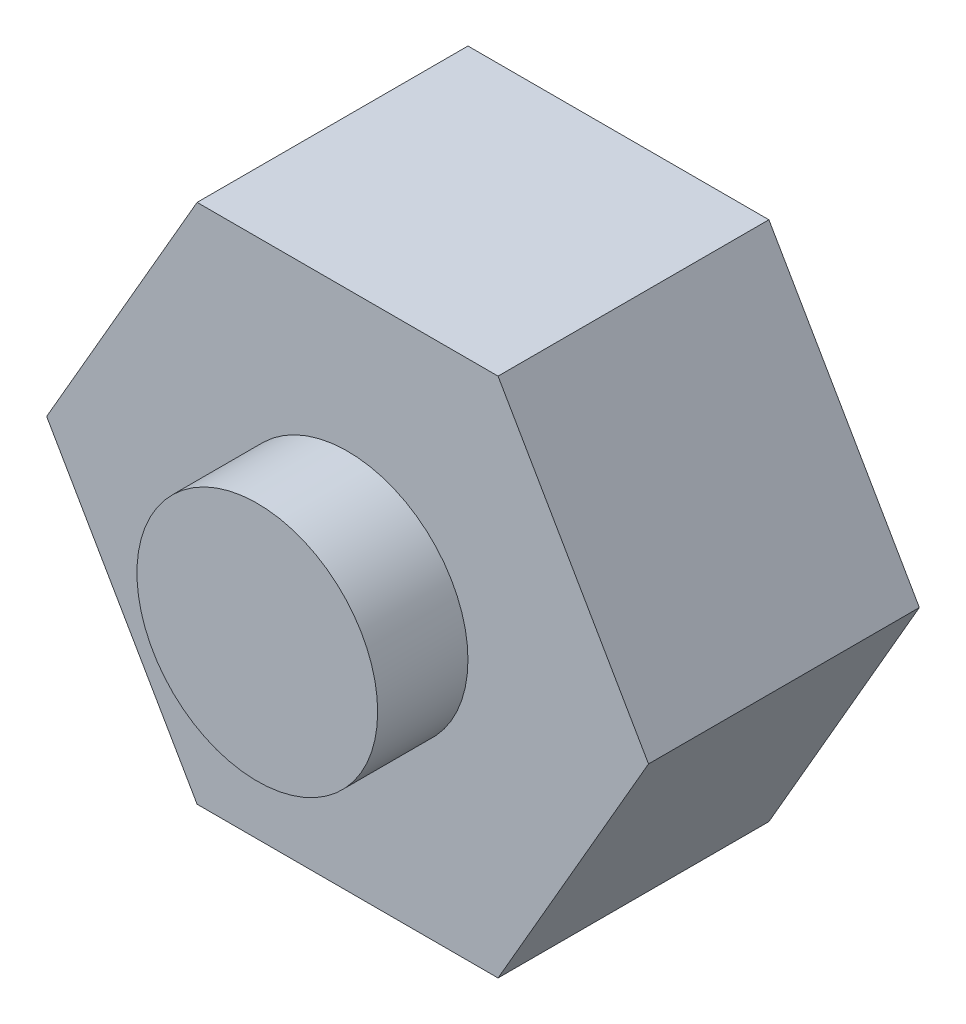
ISO-10303-21;
HEADER;
FILE_DESCRIPTION(('STEP AP214'),'2;1');
FILE_NAME('part.step','',(''),(''),'','','');
FILE_SCHEMA(('AUTOMOTIVE_DESIGN { 1 0 10303 214 1 1 1 1 }'));
ENDSEC;
DATA;
#1=APPLICATION_CONTEXT('core data for automotive mechanical design processes');
#2=APPLICATION_PROTOCOL_DEFINITION('international standard','automotive_design',2000,#1);
#3=PRODUCT_CONTEXT('',#1,'mechanical');
#4=PRODUCT('Part','Part','',(#3));
#5=PRODUCT_RELATED_PRODUCT_CATEGORY('part','',(#4));
#6=PRODUCT_DEFINITION_FORMATION('','',#4);
#7=PRODUCT_DEFINITION_CONTEXT('part definition',#1,'design');
#8=PRODUCT_DEFINITION('design','',#6,#7);
#9=PRODUCT_DEFINITION_SHAPE('','',#8);
#10=(LENGTH_UNIT() NAMED_UNIT(*) SI_UNIT(.MILLI.,.METRE.));
#11=(NAMED_UNIT(*) PLANE_ANGLE_UNIT() SI_UNIT($,.RADIAN.));
#12=(NAMED_UNIT(*) SI_UNIT($,.STERADIAN.) SOLID_ANGLE_UNIT());
#13=UNCERTAINTY_MEASURE_WITH_UNIT(LENGTH_MEASURE(1.E-05),#10,'distance_accuracy_value','');
#14=(GEOMETRIC_REPRESENTATION_CONTEXT(3) GLOBAL_UNCERTAINTY_ASSIGNED_CONTEXT((#13)) GLOBAL_UNIT_ASSIGNED_CONTEXT((#10,
#11,#12)) REPRESENTATION_CONTEXT('',''));
#15=CARTESIAN_POINT('',(0.,0.,0.));
#16=DIRECTION('',(0.,0.,1.));
#17=DIRECTION('',(1.,0.,0.));
#18=AXIS2_PLACEMENT_3D('',#15,#16,#17);
#19=CARTESIAN_POINT('',(0.,0.,18.));
#20=DIRECTION('',(0.,0.,1.));
#21=DIRECTION('',(1.,0.,0.));
#22=AXIS2_PLACEMENT_3D('',#19,#20,#21);
#23=PLANE('',#22);
#24=CARTESIAN_POINT('',(0.,0.,18.));
#25=DIRECTION('',(0.,0.,1.));
#26=DIRECTION('',(1.,0.,0.));
#27=AXIS2_PLACEMENT_3D('',#24,#25,#26);
#28=CIRCLE('',#27,8.);
#29=CARTESIAN_POINT('',(8.,0.,18.));
#30=VERTEX_POINT('',#29);
#31=EDGE_CURVE('E46',#30,#30,#28,.T.);
#32=ORIENTED_EDGE('',*,*,#31,.F.);
#33=EDGE_LOOP('',(#32));
#34=FACE_BOUND('',#33,.T.);
#35=DIRECTION('',(1.,0.,0.));
#36=VECTOR('',#35,1.);
#37=CARTESIAN_POINT('',(-9.99999999999999,-17.3205080756888,18.));
#38=LINE('',#37,#36);
#39=CARTESIAN_POINT('',(-9.99999999999999,-17.3205080756888,18.));
#40=VERTEX_POINT('',#39);
#41=CARTESIAN_POINT('',(10.,-17.3205080756888,18.));
#42=VERTEX_POINT('',#41);
#43=EDGE_CURVE('E137',#40,#42,#38,.T.);
#44=ORIENTED_EDGE('',*,*,#43,.T.);
#45=DIRECTION('',(0.5,0.866025403784439,0.));
#46=VECTOR('',#45,1.);
#47=CARTESIAN_POINT('',(10.,-17.3205080756888,18.));
#48=LINE('',#47,#46);
#49=CARTESIAN_POINT('',(20.,0.,18.));
#50=VERTEX_POINT('',#49);
#51=EDGE_CURVE('E126',#42,#50,#48,.T.);
#52=ORIENTED_EDGE('',*,*,#51,.T.);
#53=DIRECTION('',(-0.5,0.866025403784439,0.));
#54=VECTOR('',#53,1.);
#55=CARTESIAN_POINT('',(20.,0.,18.));
#56=LINE('',#55,#54);
#57=CARTESIAN_POINT('',(10.,17.3205080756888,18.));
#58=VERTEX_POINT('',#57);
#59=EDGE_CURVE('E129',#50,#58,#56,.T.);
#60=ORIENTED_EDGE('',*,*,#59,.T.);
#61=DIRECTION('',(-1.,0.,0.));
#62=VECTOR('',#61,1.);
#63=CARTESIAN_POINT('',(10.,17.3205080756888,18.));
#64=LINE('',#63,#62);
#65=CARTESIAN_POINT('',(-9.99999999999999,17.3205080756888,18.));
#66=VERTEX_POINT('',#65);
#67=EDGE_CURVE('E57',#58,#66,#64,.T.);
#68=ORIENTED_EDGE('',*,*,#67,.T.);
#69=DIRECTION('',(-0.5,-0.866025403784438,0.));
#70=VECTOR('',#69,1.);
#71=CARTESIAN_POINT('',(-9.99999999999999,17.3205080756888,18.));
#72=LINE('',#71,#70);
#73=CARTESIAN_POINT('',(-20.,0.,18.));
#74=VERTEX_POINT('',#73);
#75=EDGE_CURVE('E102',#66,#74,#72,.T.);
#76=ORIENTED_EDGE('',*,*,#75,.T.);
#77=DIRECTION('',(0.5,-0.866025403784438,0.));
#78=VECTOR('',#77,1.);
#79=CARTESIAN_POINT('',(-20.,0.,18.));
#80=LINE('',#79,#78);
#81=EDGE_CURVE('E134',#74,#40,#80,.T.);
#82=ORIENTED_EDGE('',*,*,#81,.T.);
#83=EDGE_LOOP('',(#44,#52,#60,#68,#76,#82));
#84=FACE_BOUND('',#83,.T.);
#85=ADVANCED_FACE('F42',(#34,#84),#23,.T.);
#86=CARTESIAN_POINT('',(0.,0.,24.));
#87=DIRECTION('',(0.,0.,-1.));
#88=DIRECTION('',(-1.,0.,0.));
#89=AXIS2_PLACEMENT_3D('',#86,#87,#88);
#90=CYLINDRICAL_SURFACE('',#89,8.);
#91=ORIENTED_EDGE('',*,*,#31,.T.);
#92=EDGE_LOOP('',(#91));
#93=FACE_BOUND('',#92,.T.);
#94=CARTESIAN_POINT('',(0.,0.,24.));
#95=DIRECTION('',(0.,0.,1.));
#96=DIRECTION('',(1.,0.,0.));
#97=AXIS2_PLACEMENT_3D('',#94,#95,#96);
#98=CIRCLE('',#97,8.);
#99=CARTESIAN_POINT('',(8.,0.,24.));
#100=VERTEX_POINT('',#99);
#101=EDGE_CURVE('E12',#100,#100,#98,.T.);
#102=ORIENTED_EDGE('',*,*,#101,.F.);
#103=EDGE_LOOP('',(#102));
#104=FACE_BOUND('',#103,.T.);
#105=ADVANCED_FACE('F44',(#93,#104),#90,.T.);
#106=CARTESIAN_POINT('',(0.,0.,24.));
#107=DIRECTION('',(0.,0.,1.));
#108=DIRECTION('',(1.,0.,0.));
#109=AXIS2_PLACEMENT_3D('',#106,#107,#108);
#110=PLANE('',#109);
#111=ORIENTED_EDGE('',*,*,#101,.T.);
#112=EDGE_LOOP('',(#111));
#113=FACE_BOUND('',#112,.T.);
#114=ADVANCED_FACE('F174',(#113),#110,.T.);
#115=CARTESIAN_POINT('',(10.,-17.3205080756888,0.));
#116=DIRECTION('',(0.866025403784439,-0.5,0.));
#117=DIRECTION('',(0.5,0.866025403784439,0.));
#118=AXIS2_PLACEMENT_3D('',#115,#116,#117);
#119=PLANE('',#118);
#120=ORIENTED_EDGE('',*,*,#51,.F.);
#121=DIRECTION('',(0.,0.,1.));
#122=VECTOR('',#121,1.);
#123=CARTESIAN_POINT('',(10.,-17.3205080756888,0.));
#124=LINE('',#123,#122);
#125=CARTESIAN_POINT('',(10.,-17.3205080756888,0.));
#126=VERTEX_POINT('',#125);
#127=EDGE_CURVE('E140',#126,#42,#124,.T.);
#128=ORIENTED_EDGE('',*,*,#127,.F.);
#129=DIRECTION('',(0.5,0.866025403784439,0.));
#130=VECTOR('',#129,1.);
#131=CARTESIAN_POINT('',(10.,-17.3205080756888,0.));
#132=LINE('',#131,#130);
#133=CARTESIAN_POINT('',(20.,0.,0.));
#134=VERTEX_POINT('',#133);
#135=EDGE_CURVE('E65',#126,#134,#132,.T.);
#136=ORIENTED_EDGE('',*,*,#135,.T.);
#137=DIRECTION('',(0.,0.,1.));
#138=VECTOR('',#137,1.);
#139=CARTESIAN_POINT('',(20.,0.,0.));
#140=LINE('',#139,#138);
#141=EDGE_CURVE('E125',#134,#50,#140,.T.);
#142=ORIENTED_EDGE('',*,*,#141,.T.);
#143=EDGE_LOOP('',(#120,#128,#136,#142));
#144=FACE_BOUND('',#143,.T.);
#145=ADVANCED_FACE('F148',(#144),#119,.T.);
#146=CARTESIAN_POINT('',(-9.99999999999999,-17.3205080756888,0.));
#147=DIRECTION('',(0.,-1.,0.));
#148=DIRECTION('',(0.,0.,-1.));
#149=AXIS2_PLACEMENT_3D('',#146,#147,#148);
#150=PLANE('',#149);
#151=ORIENTED_EDGE('',*,*,#43,.F.);
#152=DIRECTION('',(0.,0.,1.));
#153=VECTOR('',#152,1.);
#154=CARTESIAN_POINT('',(-9.99999999999999,-17.3205080756888,0.));
#155=LINE('',#154,#153);
#156=CARTESIAN_POINT('',(-9.99999999999999,-17.3205080756888,0.));
#157=VERTEX_POINT('',#156);
#158=EDGE_CURVE('E142',#157,#40,#155,.T.);
#159=ORIENTED_EDGE('',*,*,#158,.F.);
#160=DIRECTION('',(1.,0.,0.));
#161=VECTOR('',#160,1.);
#162=CARTESIAN_POINT('',(-9.99999999999999,-17.3205080756888,0.));
#163=LINE('',#162,#161);
#164=EDGE_CURVE('E119',#157,#126,#163,.T.);
#165=ORIENTED_EDGE('',*,*,#164,.T.);
#166=ORIENTED_EDGE('',*,*,#127,.T.);
#167=EDGE_LOOP('',(#151,#159,#165,#166));
#168=FACE_BOUND('',#167,.T.);
#169=ADVANCED_FACE('F155',(#168),#150,.T.);
#170=CARTESIAN_POINT('',(-20.,0.,0.));
#171=DIRECTION('',(-0.866025403784438,-0.5,0.));
#172=DIRECTION('',(0.5,-0.866025403784439,0.));
#173=AXIS2_PLACEMENT_3D('',#170,#171,#172);
#174=PLANE('',#173);
#175=ORIENTED_EDGE('',*,*,#81,.F.);
#176=DIRECTION('',(0.,0.,1.));
#177=VECTOR('',#176,1.);
#178=CARTESIAN_POINT('',(-20.,0.,0.));
#179=LINE('',#178,#177);
#180=CARTESIAN_POINT('',(-20.,0.,0.));
#181=VERTEX_POINT('',#180);
#182=EDGE_CURVE('E103',#181,#74,#179,.T.);
#183=ORIENTED_EDGE('',*,*,#182,.F.);
#184=DIRECTION('',(0.5,-0.866025403784438,0.));
#185=VECTOR('',#184,1.);
#186=CARTESIAN_POINT('',(-20.,0.,0.));
#187=LINE('',#186,#185);
#188=EDGE_CURVE('E117',#181,#157,#187,.T.);
#189=ORIENTED_EDGE('',*,*,#188,.T.);
#190=ORIENTED_EDGE('',*,*,#158,.T.);
#191=EDGE_LOOP('',(#175,#183,#189,#190));
#192=FACE_BOUND('',#191,.T.);
#193=ADVANCED_FACE('F158',(#192),#174,.T.);
#194=CARTESIAN_POINT('',(-9.99999999999999,17.3205080756888,0.));
#195=DIRECTION('',(-0.866025403784438,0.5,0.));
#196=DIRECTION('',(-0.5,-0.866025403784439,0.));
#197=AXIS2_PLACEMENT_3D('',#194,#195,#196);
#198=PLANE('',#197);
#199=ORIENTED_EDGE('',*,*,#75,.F.);
#200=DIRECTION('',(0.,0.,1.));
#201=VECTOR('',#200,1.);
#202=CARTESIAN_POINT('',(-9.99999999999999,17.3205080756888,0.));
#203=LINE('',#202,#201);
#204=CARTESIAN_POINT('',(-9.99999999999999,17.3205080756888,0.));
#205=VERTEX_POINT('',#204);
#206=EDGE_CURVE('E95',#205,#66,#203,.T.);
#207=ORIENTED_EDGE('',*,*,#206,.F.);
#208=DIRECTION('',(-0.5,-0.866025403784438,0.));
#209=VECTOR('',#208,1.);
#210=CARTESIAN_POINT('',(-9.99999999999999,17.3205080756888,0.));
#211=LINE('',#210,#209);
#212=EDGE_CURVE('E99',#205,#181,#211,.T.);
#213=ORIENTED_EDGE('',*,*,#212,.T.);
#214=ORIENTED_EDGE('',*,*,#182,.T.);
#215=EDGE_LOOP('',(#199,#207,#213,#214));
#216=FACE_BOUND('',#215,.T.);
#217=ADVANCED_FACE('F97',(#216),#198,.T.);
#218=CARTESIAN_POINT('',(10.,17.3205080756888,0.));
#219=DIRECTION('',(0.,1.,0.));
#220=DIRECTION('',(0.,0.,1.));
#221=AXIS2_PLACEMENT_3D('',#218,#219,#220);
#222=PLANE('',#221);
#223=ORIENTED_EDGE('',*,*,#67,.F.);
#224=DIRECTION('',(0.,0.,1.));
#225=VECTOR('',#224,1.);
#226=CARTESIAN_POINT('',(10.,17.3205080756888,0.));
#227=LINE('',#226,#225);
#228=CARTESIAN_POINT('',(10.,17.3205080756888,0.));
#229=VERTEX_POINT('',#228);
#230=EDGE_CURVE('E104',#229,#58,#227,.T.);
#231=ORIENTED_EDGE('',*,*,#230,.F.);
#232=DIRECTION('',(-1.,0.,0.));
#233=VECTOR('',#232,1.);
#234=CARTESIAN_POINT('',(10.,17.3205080756888,0.));
#235=LINE('',#234,#233);
#236=EDGE_CURVE('E107',#229,#205,#235,.T.);
#237=ORIENTED_EDGE('',*,*,#236,.T.);
#238=ORIENTED_EDGE('',*,*,#206,.T.);
#239=EDGE_LOOP('',(#223,#231,#237,#238));
#240=FACE_BOUND('',#239,.T.);
#241=ADVANCED_FACE('F108',(#240),#222,.T.);
#242=CARTESIAN_POINT('',(20.,0.,0.));
#243=DIRECTION('',(0.866025403784439,0.5,0.));
#244=DIRECTION('',(-0.5,0.866025403784439,0.));
#245=AXIS2_PLACEMENT_3D('',#242,#243,#244);
#246=PLANE('',#245);
#247=ORIENTED_EDGE('',*,*,#59,.F.);
#248=ORIENTED_EDGE('',*,*,#141,.F.);
#249=DIRECTION('',(-0.5,0.866025403784439,0.));
#250=VECTOR('',#249,1.);
#251=CARTESIAN_POINT('',(20.,0.,0.));
#252=LINE('',#251,#250);
#253=EDGE_CURVE('E112',#134,#229,#252,.T.);
#254=ORIENTED_EDGE('',*,*,#253,.T.);
#255=ORIENTED_EDGE('',*,*,#230,.T.);
#256=EDGE_LOOP('',(#247,#248,#254,#255));
#257=FACE_BOUND('',#256,.T.);
#258=ADVANCED_FACE('F150',(#257),#246,.T.);
#259=CARTESIAN_POINT('',(0.,0.,0.));
#260=DIRECTION('',(0.,0.,1.));
#261=DIRECTION('',(1.,0.,0.));
#262=AXIS2_PLACEMENT_3D('',#259,#260,#261);
#263=PLANE('',#262);
#264=ORIENTED_EDGE('',*,*,#135,.F.);
#265=ORIENTED_EDGE('',*,*,#164,.F.);
#266=ORIENTED_EDGE('',*,*,#188,.F.);
#267=ORIENTED_EDGE('',*,*,#212,.F.);
#268=ORIENTED_EDGE('',*,*,#236,.F.);
#269=ORIENTED_EDGE('',*,*,#253,.F.);
#270=EDGE_LOOP('',(#264,#265,#266,#267,#268,#269));
#271=FACE_BOUND('',#270,.T.);
#272=ADVANCED_FACE('F114',(#271),#263,.F.);
#273=CLOSED_SHELL('',(#85,#105,#114,#145,#169,#193,#217,#241,#258,#272));
#274=MANIFOLD_SOLID_BREP('B2',#273);
#275=ADVANCED_BREP_SHAPE_REPRESENTATION('',(#18,#274),#14);
#276=SHAPE_DEFINITION_REPRESENTATION(#9,#275);
ENDSEC;
END-ISO-10303-21;
